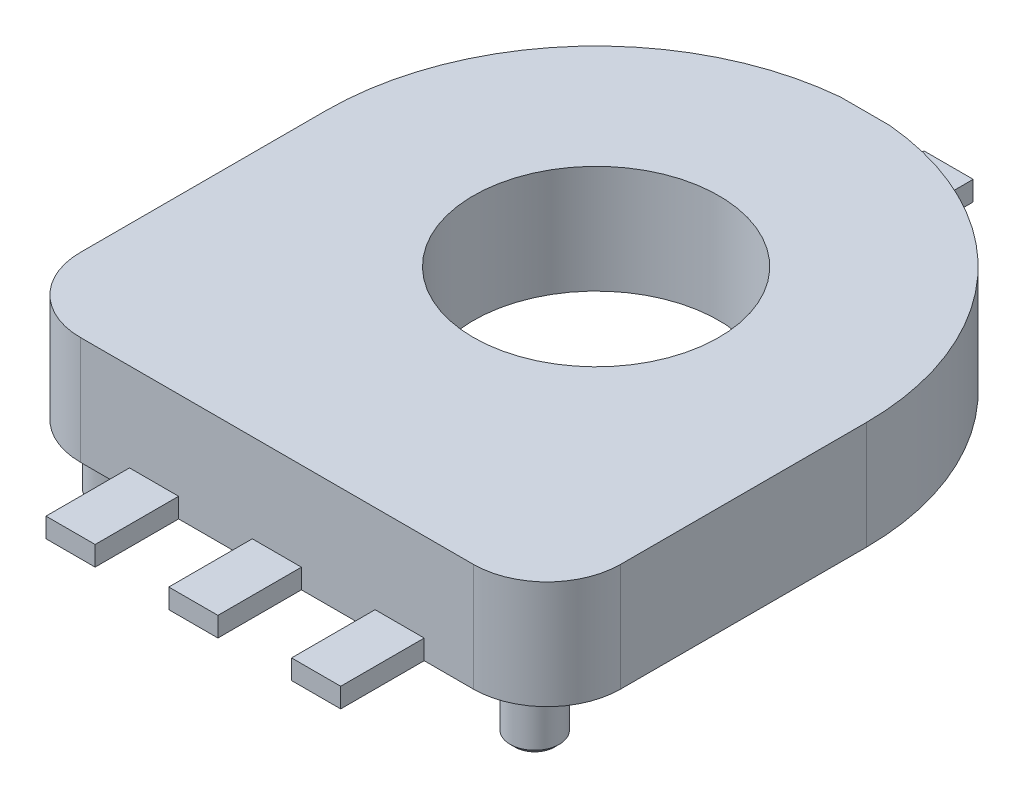
ISO-10303-21;
HEADER;
FILE_DESCRIPTION(('STEP AP214'),'2;1');
FILE_NAME('part.step','',(''),(''),'','','');
FILE_SCHEMA(('AUTOMOTIVE_DESIGN { 1 0 10303 214 1 1 1 1 }'));
ENDSEC;
DATA;
#1=APPLICATION_CONTEXT('core data for automotive mechanical design processes');
#2=APPLICATION_PROTOCOL_DEFINITION('international standard','automotive_design',2000,#1);
#3=PRODUCT_CONTEXT('',#1,'mechanical');
#4=PRODUCT('Part','Part','',(#3));
#5=PRODUCT_RELATED_PRODUCT_CATEGORY('part','',(#4));
#6=PRODUCT_DEFINITION_FORMATION('','',#4);
#7=PRODUCT_DEFINITION_CONTEXT('part definition',#1,'design');
#8=PRODUCT_DEFINITION('design','',#6,#7);
#9=PRODUCT_DEFINITION_SHAPE('','',#8);
#10=(LENGTH_UNIT() NAMED_UNIT(*) SI_UNIT(.MILLI.,.METRE.));
#11=(NAMED_UNIT(*) PLANE_ANGLE_UNIT() SI_UNIT($,.RADIAN.));
#12=(NAMED_UNIT(*) SI_UNIT($,.STERADIAN.) SOLID_ANGLE_UNIT());
#13=UNCERTAINTY_MEASURE_WITH_UNIT(LENGTH_MEASURE(1.E-05),#10,'distance_accuracy_value','');
#14=(GEOMETRIC_REPRESENTATION_CONTEXT(3) GLOBAL_UNCERTAINTY_ASSIGNED_CONTEXT((#13)) GLOBAL_UNIT_ASSIGNED_CONTEXT((#10,
#11,#12)) REPRESENTATION_CONTEXT('',''));
#15=CARTESIAN_POINT('',(0.,0.,0.));
#16=DIRECTION('',(0.,0.,1.));
#17=DIRECTION('',(1.,0.,0.));
#18=AXIS2_PLACEMENT_3D('',#15,#16,#17);
#19=CARTESIAN_POINT('',(5.,1.1,0.));
#20=DIRECTION('',(1.,0.,0.));
#21=DIRECTION('',(0.,0.,-1.));
#22=AXIS2_PLACEMENT_3D('',#19,#20,#21);
#23=PLANE('',#22);
#24=DIRECTION('',(0.,0.,1.));
#25=VECTOR('',#24,1.);
#26=CARTESIAN_POINT('',(5.,-0.7,0.));
#27=LINE('',#26,#25);
#28=CARTESIAN_POINT('',(5.,-0.7,0.));
#29=VERTEX_POINT('',#28);
#30=CARTESIAN_POINT('',(5.,-0.7,1.7));
#31=VERTEX_POINT('',#30);
#32=EDGE_CURVE('E786',#29,#31,#27,.T.);
#33=ORIENTED_EDGE('',*,*,#32,.F.);
#34=DIRECTION('',(0.,-1.,0.));
#35=VECTOR('',#34,1.);
#36=CARTESIAN_POINT('',(5.,1.1,0.));
#37=LINE('',#36,#35);
#38=CARTESIAN_POINT('',(5.,-1.1,0.));
#39=VERTEX_POINT('',#38);
#40=EDGE_CURVE('E145',#29,#39,#37,.T.);
#41=ORIENTED_EDGE('',*,*,#40,.T.);
#42=DIRECTION('',(0.,0.,1.));
#43=VECTOR('',#42,1.);
#44=CARTESIAN_POINT('',(5.,-1.1,0.));
#45=LINE('',#44,#43);
#46=CARTESIAN_POINT('',(5.,-1.1,1.7));
#47=VERTEX_POINT('',#46);
#48=EDGE_CURVE('E206',#39,#47,#45,.T.);
#49=ORIENTED_EDGE('',*,*,#48,.T.);
#50=DIRECTION('',(0.,-1.,0.));
#51=VECTOR('',#50,1.);
#52=CARTESIAN_POINT('',(5.,1.1,1.7));
#53=LINE('',#52,#51);
#54=EDGE_CURVE('E342',#31,#47,#53,.T.);
#55=ORIENTED_EDGE('',*,*,#54,.F.);
#56=EDGE_LOOP('',(#33,#41,#49,#55));
#57=FACE_BOUND('',#56,.T.);
#58=ADVANCED_FACE('F47',(#57),#23,.F.);
#59=CARTESIAN_POINT('',(0.,1.1,1.7));
#60=DIRECTION('',(0.,0.,-1.));
#61=DIRECTION('',(-1.,0.,0.));
#62=AXIS2_PLACEMENT_3D('',#59,#60,#61);
#63=PLANE('',#62);
#64=DIRECTION('',(1.,0.,0.));
#65=VECTOR('',#64,1.);
#66=CARTESIAN_POINT('',(0.,-0.7,1.7));
#67=LINE('',#66,#65);
#68=CARTESIAN_POINT('',(6.,-0.7,1.7));
#69=VERTEX_POINT('',#68);
#70=EDGE_CURVE('E832',#31,#69,#67,.T.);
#71=ORIENTED_EDGE('',*,*,#70,.F.);
#72=ORIENTED_EDGE('',*,*,#54,.T.);
#73=DIRECTION('',(1.,0.,0.));
#74=VECTOR('',#73,1.);
#75=CARTESIAN_POINT('',(0.,-1.1,1.7));
#76=LINE('',#75,#74);
#77=CARTESIAN_POINT('',(6.,-1.1,1.7));
#78=VERTEX_POINT('',#77);
#79=EDGE_CURVE('E209',#47,#78,#76,.T.);
#80=ORIENTED_EDGE('',*,*,#79,.T.);
#81=DIRECTION('',(0.,-1.,0.));
#82=VECTOR('',#81,1.);
#83=CARTESIAN_POINT('',(6.,1.1,1.7));
#84=LINE('',#83,#82);
#85=EDGE_CURVE('E339',#69,#78,#84,.T.);
#86=ORIENTED_EDGE('',*,*,#85,.F.);
#87=EDGE_LOOP('',(#71,#72,#80,#86));
#88=FACE_BOUND('',#87,.T.);
#89=ADVANCED_FACE('F373',(#88),#63,.F.);
#90=CARTESIAN_POINT('',(6.,1.1,0.));
#91=DIRECTION('',(1.,0.,0.));
#92=DIRECTION('',(0.,0.,-1.));
#93=AXIS2_PLACEMENT_3D('',#90,#91,#92);
#94=PLANE('',#93);
#95=DIRECTION('',(0.,-1.,0.));
#96=VECTOR('',#95,1.);
#97=CARTESIAN_POINT('',(6.,1.1,0.));
#98=LINE('',#97,#96);
#99=CARTESIAN_POINT('',(6.,-0.7,0.));
#100=VERTEX_POINT('',#99);
#101=CARTESIAN_POINT('',(6.,-1.1,0.));
#102=VERTEX_POINT('',#101);
#103=EDGE_CURVE('E336',#100,#102,#98,.T.);
#104=ORIENTED_EDGE('',*,*,#103,.F.);
#105=DIRECTION('',(0.,0.,-1.));
#106=VECTOR('',#105,1.);
#107=CARTESIAN_POINT('',(6.,-0.7,0.));
#108=LINE('',#107,#106);
#109=EDGE_CURVE('E835',#69,#100,#108,.T.);
#110=ORIENTED_EDGE('',*,*,#109,.F.);
#111=ORIENTED_EDGE('',*,*,#85,.T.);
#112=DIRECTION('',(0.,0.,1.));
#113=VECTOR('',#112,1.);
#114=CARTESIAN_POINT('',(6.,-1.1,0.));
#115=LINE('',#114,#113);
#116=EDGE_CURVE('E214',#102,#78,#115,.T.);
#117=ORIENTED_EDGE('',*,*,#116,.F.);
#118=EDGE_LOOP('',(#104,#110,#111,#117));
#119=FACE_BOUND('',#118,.T.);
#120=ADVANCED_FACE('F377',(#119),#94,.T.);
#121=CARTESIAN_POINT('',(7.5,1.1,0.));
#122=DIRECTION('',(1.,0.,0.));
#123=DIRECTION('',(0.,0.,-1.));
#124=AXIS2_PLACEMENT_3D('',#121,#122,#123);
#125=PLANE('',#124);
#126=DIRECTION('',(0.,0.,1.));
#127=VECTOR('',#126,1.);
#128=CARTESIAN_POINT('',(7.5,-0.7,0.));
#129=LINE('',#128,#127);
#130=CARTESIAN_POINT('',(7.5,-0.7,0.));
#131=VERTEX_POINT('',#130);
#132=CARTESIAN_POINT('',(7.5,-0.7,1.7));
#133=VERTEX_POINT('',#132);
#134=EDGE_CURVE('E830',#131,#133,#129,.T.);
#135=ORIENTED_EDGE('',*,*,#134,.F.);
#136=DIRECTION('',(0.,-1.,0.));
#137=VECTOR('',#136,1.);
#138=CARTESIAN_POINT('',(7.5,1.1,0.));
#139=LINE('',#138,#137);
#140=CARTESIAN_POINT('',(7.5,-1.1,0.));
#141=VERTEX_POINT('',#140);
#142=EDGE_CURVE('E333',#131,#141,#139,.T.);
#143=ORIENTED_EDGE('',*,*,#142,.T.);
#144=DIRECTION('',(0.,0.,1.));
#145=VECTOR('',#144,1.);
#146=CARTESIAN_POINT('',(7.5,-1.1,0.));
#147=LINE('',#146,#145);
#148=CARTESIAN_POINT('',(7.5,-1.1,1.7));
#149=VERTEX_POINT('',#148);
#150=EDGE_CURVE('E222',#141,#149,#147,.T.);
#151=ORIENTED_EDGE('',*,*,#150,.T.);
#152=DIRECTION('',(0.,-1.,0.));
#153=VECTOR('',#152,1.);
#154=CARTESIAN_POINT('',(7.5,1.1,1.7));
#155=LINE('',#154,#153);
#156=EDGE_CURVE('E330',#133,#149,#155,.T.);
#157=ORIENTED_EDGE('',*,*,#156,.F.);
#158=EDGE_LOOP('',(#135,#143,#151,#157));
#159=FACE_BOUND('',#158,.T.);
#160=ADVANCED_FACE('F388',(#159),#125,.F.);
#161=CARTESIAN_POINT('',(0.,1.1,1.7));
#162=DIRECTION('',(0.,0.,-1.));
#163=DIRECTION('',(-1.,0.,0.));
#164=AXIS2_PLACEMENT_3D('',#161,#162,#163);
#165=PLANE('',#164);
#166=DIRECTION('',(1.,0.,0.));
#167=VECTOR('',#166,1.);
#168=CARTESIAN_POINT('',(0.,-0.7,1.7));
#169=LINE('',#168,#167);
#170=CARTESIAN_POINT('',(8.5,-0.7,1.7));
#171=VERTEX_POINT('',#170);
#172=EDGE_CURVE('E827',#133,#171,#169,.T.);
#173=ORIENTED_EDGE('',*,*,#172,.F.);
#174=ORIENTED_EDGE('',*,*,#156,.T.);
#175=DIRECTION('',(1.,0.,0.));
#176=VECTOR('',#175,1.);
#177=CARTESIAN_POINT('',(0.,-1.1,1.7));
#178=LINE('',#177,#176);
#179=CARTESIAN_POINT('',(8.5,-1.1,1.7));
#180=VERTEX_POINT('',#179);
#181=EDGE_CURVE('E228',#149,#180,#178,.T.);
#182=ORIENTED_EDGE('',*,*,#181,.T.);
#183=DIRECTION('',(0.,-1.,0.));
#184=VECTOR('',#183,1.);
#185=CARTESIAN_POINT('',(8.5,1.1,1.7));
#186=LINE('',#185,#184);
#187=EDGE_CURVE('E327',#171,#180,#186,.T.);
#188=ORIENTED_EDGE('',*,*,#187,.F.);
#189=EDGE_LOOP('',(#173,#174,#182,#188));
#190=FACE_BOUND('',#189,.T.);
#191=ADVANCED_FACE('F392',(#190),#165,.F.);
#192=CARTESIAN_POINT('',(8.5,1.1,0.));
#193=DIRECTION('',(1.,0.,0.));
#194=DIRECTION('',(0.,0.,-1.));
#195=AXIS2_PLACEMENT_3D('',#192,#193,#194);
#196=PLANE('',#195);
#197=DIRECTION('',(0.,-1.,0.));
#198=VECTOR('',#197,1.);
#199=CARTESIAN_POINT('',(8.5,1.1,0.));
#200=LINE('',#199,#198);
#201=CARTESIAN_POINT('',(8.5,-0.7,0.));
#202=VERTEX_POINT('',#201);
#203=CARTESIAN_POINT('',(8.5,-1.1,0.));
#204=VERTEX_POINT('',#203);
#205=EDGE_CURVE('E324',#202,#204,#200,.T.);
#206=ORIENTED_EDGE('',*,*,#205,.F.);
#207=DIRECTION('',(0.,0.,-1.));
#208=VECTOR('',#207,1.);
#209=CARTESIAN_POINT('',(8.5,-0.7,0.));
#210=LINE('',#209,#208);
#211=EDGE_CURVE('E210',#171,#202,#210,.T.);
#212=ORIENTED_EDGE('',*,*,#211,.F.);
#213=ORIENTED_EDGE('',*,*,#187,.T.);
#214=DIRECTION('',(0.,0.,1.));
#215=VECTOR('',#214,1.);
#216=CARTESIAN_POINT('',(8.5,-1.1,0.));
#217=LINE('',#216,#215);
#218=EDGE_CURVE('E232',#204,#180,#217,.T.);
#219=ORIENTED_EDGE('',*,*,#218,.F.);
#220=EDGE_LOOP('',(#206,#212,#213,#219));
#221=FACE_BOUND('',#220,.T.);
#222=ADVANCED_FACE('F396',(#221),#196,.T.);
#223=CARTESIAN_POINT('',(6.00000000000001,1.1,0.));
#224=DIRECTION('',(1.,0.,0.));
#225=DIRECTION('',(0.,0.,-1.));
#226=AXIS2_PLACEMENT_3D('',#223,#224,#225);
#227=PLANE('',#226);
#228=DIRECTION('',(0.,-1.,0.));
#229=VECTOR('',#228,1.);
#230=CARTESIAN_POINT('',(6.,1.1,-13.6772255750517));
#231=LINE('',#230,#229);
#232=CARTESIAN_POINT('',(6.,-0.7,-13.6772255750517));
#233=VERTEX_POINT('',#232);
#234=CARTESIAN_POINT('',(6.,-1.1,-13.6772255750517));
#235=VERTEX_POINT('',#234);
#236=EDGE_CURVE('E307',#233,#235,#231,.T.);
#237=ORIENTED_EDGE('',*,*,#236,.F.);
#238=DIRECTION('',(0.,0.,-1.));
#239=VECTOR('',#238,1.);
#240=CARTESIAN_POINT('',(6.00000000000001,-0.7,0.));
#241=LINE('',#240,#239);
#242=CARTESIAN_POINT('',(6.,-0.7,-11.9772255750517));
#243=VERTEX_POINT('',#242);
#244=EDGE_CURVE('E765',#243,#233,#241,.T.);
#245=ORIENTED_EDGE('',*,*,#244,.F.);
#246=DIRECTION('',(0.,-1.,0.));
#247=VECTOR('',#246,1.);
#248=CARTESIAN_POINT('',(6.,1.1,-11.9772255750517));
#249=LINE('',#248,#247);
#250=CARTESIAN_POINT('',(6.,-1.1,-11.9772255750517));
#251=VERTEX_POINT('',#250);
#252=EDGE_CURVE('E310',#243,#251,#249,.T.);
#253=ORIENTED_EDGE('',*,*,#252,.T.);
#254=DIRECTION('',(0.,0.,1.));
#255=VECTOR('',#254,1.);
#256=CARTESIAN_POINT('',(6.00000000000001,-1.1,0.));
#257=LINE('',#256,#255);
#258=EDGE_CURVE('E248',#235,#251,#257,.T.);
#259=ORIENTED_EDGE('',*,*,#258,.F.);
#260=EDGE_LOOP('',(#237,#245,#253,#259));
#261=FACE_BOUND('',#260,.T.);
#262=ADVANCED_FACE('F400',(#261),#227,.T.);
#263=CARTESIAN_POINT('',(0.,1.1,-13.6772255750517));
#264=DIRECTION('',(0.,0.,1.));
#265=DIRECTION('',(1.,0.,0.));
#266=AXIS2_PLACEMENT_3D('',#263,#264,#265);
#267=PLANE('',#266);
#268=DIRECTION('',(-1.,0.,0.));
#269=VECTOR('',#268,1.);
#270=CARTESIAN_POINT('',(0.,-0.7,-13.6772255750517));
#271=LINE('',#270,#269);
#272=CARTESIAN_POINT('',(5.,-0.7,-13.6772255750517));
#273=VERTEX_POINT('',#272);
#274=EDGE_CURVE('E796',#233,#273,#271,.T.);
#275=ORIENTED_EDGE('',*,*,#274,.F.);
#276=ORIENTED_EDGE('',*,*,#236,.T.);
#277=DIRECTION('',(-1.,0.,0.));
#278=VECTOR('',#277,1.);
#279=CARTESIAN_POINT('',(0.,-1.1,-13.6772255750517));
#280=LINE('',#279,#278);
#281=CARTESIAN_POINT('',(5.,-1.1,-13.6772255750517));
#282=VERTEX_POINT('',#281);
#283=EDGE_CURVE('E252',#235,#282,#280,.T.);
#284=ORIENTED_EDGE('',*,*,#283,.T.);
#285=DIRECTION('',(0.,-1.,0.));
#286=VECTOR('',#285,1.);
#287=CARTESIAN_POINT('',(5.,1.1,-13.6772255750517));
#288=LINE('',#287,#286);
#289=EDGE_CURVE('E304',#273,#282,#288,.T.);
#290=ORIENTED_EDGE('',*,*,#289,.F.);
#291=EDGE_LOOP('',(#275,#276,#284,#290));
#292=FACE_BOUND('',#291,.T.);
#293=ADVANCED_FACE('F413',(#292),#267,.F.);
#294=CARTESIAN_POINT('',(5.,1.1,0.));
#295=DIRECTION('',(1.,0.,0.));
#296=DIRECTION('',(0.,0.,-1.));
#297=AXIS2_PLACEMENT_3D('',#294,#295,#296);
#298=PLANE('',#297);
#299=DIRECTION('',(0.,0.,1.));
#300=VECTOR('',#299,1.);
#301=CARTESIAN_POINT('',(5.,-0.7,0.));
#302=LINE('',#301,#300);
#303=CARTESIAN_POINT('',(5.,-0.7,-11.9772255750517));
#304=VERTEX_POINT('',#303);
#305=EDGE_CURVE('E800',#273,#304,#302,.T.);
#306=ORIENTED_EDGE('',*,*,#305,.F.);
#307=ORIENTED_EDGE('',*,*,#289,.T.);
#308=DIRECTION('',(0.,0.,1.));
#309=VECTOR('',#308,1.);
#310=CARTESIAN_POINT('',(5.,-1.1,0.));
#311=LINE('',#310,#309);
#312=CARTESIAN_POINT('',(5.,-1.1,-11.9772255750517));
#313=VERTEX_POINT('',#312);
#314=EDGE_CURVE('E256',#282,#313,#311,.T.);
#315=ORIENTED_EDGE('',*,*,#314,.T.);
#316=DIRECTION('',(0.,-1.,0.));
#317=VECTOR('',#316,1.);
#318=CARTESIAN_POINT('',(5.,1.1,-11.9772255750517));
#319=LINE('',#318,#317);
#320=EDGE_CURVE('E178',#304,#313,#319,.T.);
#321=ORIENTED_EDGE('',*,*,#320,.F.);
#322=EDGE_LOOP('',(#306,#307,#315,#321));
#323=FACE_BOUND('',#322,.T.);
#324=ADVANCED_FACE('F417',(#323),#298,.F.);
#325=CARTESIAN_POINT('',(2.5,1.1,0.));
#326=DIRECTION('',(1.,0.,0.));
#327=DIRECTION('',(0.,0.,-1.));
#328=AXIS2_PLACEMENT_3D('',#325,#326,#327);
#329=PLANE('',#328);
#330=DIRECTION('',(0.,0.,1.));
#331=VECTOR('',#330,1.);
#332=CARTESIAN_POINT('',(2.5,-0.7,0.));
#333=LINE('',#332,#331);
#334=CARTESIAN_POINT('',(2.5,-0.7,0.));
#335=VERTEX_POINT('',#334);
#336=CARTESIAN_POINT('',(2.5,-0.7,1.7));
#337=VERTEX_POINT('',#336);
#338=EDGE_CURVE('E771',#335,#337,#333,.T.);
#339=ORIENTED_EDGE('',*,*,#338,.F.);
#340=DIRECTION('',(0.,-1.,0.));
#341=VECTOR('',#340,1.);
#342=CARTESIAN_POINT('',(2.5,1.1,0.));
#343=LINE('',#342,#341);
#344=CARTESIAN_POINT('',(2.5,-1.1,0.));
#345=VERTEX_POINT('',#344);
#346=EDGE_CURVE('E294',#335,#345,#343,.T.);
#347=ORIENTED_EDGE('',*,*,#346,.T.);
#348=DIRECTION('',(0.,0.,1.));
#349=VECTOR('',#348,1.);
#350=CARTESIAN_POINT('',(2.5,-1.1,0.));
#351=LINE('',#350,#349);
#352=CARTESIAN_POINT('',(2.5,-1.1,1.7));
#353=VERTEX_POINT('',#352);
#354=EDGE_CURVE('E268',#345,#353,#351,.T.);
#355=ORIENTED_EDGE('',*,*,#354,.T.);
#356=DIRECTION('',(0.,-1.,0.));
#357=VECTOR('',#356,1.);
#358=CARTESIAN_POINT('',(2.5,1.1,1.7));
#359=LINE('',#358,#357);
#360=EDGE_CURVE('E291',#337,#353,#359,.T.);
#361=ORIENTED_EDGE('',*,*,#360,.F.);
#362=EDGE_LOOP('',(#339,#347,#355,#361));
#363=FACE_BOUND('',#362,.T.);
#364=ADVANCED_FACE('F421',(#363),#329,.F.);
#365=CARTESIAN_POINT('',(0.,1.1,1.7));
#366=DIRECTION('',(0.,0.,-1.));
#367=DIRECTION('',(-1.,0.,0.));
#368=AXIS2_PLACEMENT_3D('',#365,#366,#367);
#369=PLANE('',#368);
#370=DIRECTION('',(1.,0.,0.));
#371=VECTOR('',#370,1.);
#372=CARTESIAN_POINT('',(0.,-0.7,1.7));
#373=LINE('',#372,#371);
#374=CARTESIAN_POINT('',(3.5,-0.7,1.7));
#375=VERTEX_POINT('',#374);
#376=EDGE_CURVE('E768',#337,#375,#373,.T.);
#377=ORIENTED_EDGE('',*,*,#376,.F.);
#378=ORIENTED_EDGE('',*,*,#360,.T.);
#379=DIRECTION('',(1.,0.,0.));
#380=VECTOR('',#379,1.);
#381=CARTESIAN_POINT('',(0.,-1.1,1.7));
#382=LINE('',#381,#380);
#383=CARTESIAN_POINT('',(3.5,-1.1,1.7));
#384=VERTEX_POINT('',#383);
#385=EDGE_CURVE('E272',#353,#384,#382,.T.);
#386=ORIENTED_EDGE('',*,*,#385,.T.);
#387=DIRECTION('',(0.,-1.,0.));
#388=VECTOR('',#387,1.);
#389=CARTESIAN_POINT('',(3.5,1.1,1.7));
#390=LINE('',#389,#388);
#391=EDGE_CURVE('E288',#375,#384,#390,.T.);
#392=ORIENTED_EDGE('',*,*,#391,.F.);
#393=EDGE_LOOP('',(#377,#378,#386,#392));
#394=FACE_BOUND('',#393,.T.);
#395=ADVANCED_FACE('F434',(#394),#369,.F.);
#396=CARTESIAN_POINT('',(3.5,1.1,0.));
#397=DIRECTION('',(1.,0.,0.));
#398=DIRECTION('',(0.,0.,-1.));
#399=AXIS2_PLACEMENT_3D('',#396,#397,#398);
#400=PLANE('',#399);
#401=DIRECTION('',(0.,-1.,0.));
#402=VECTOR('',#401,1.);
#403=CARTESIAN_POINT('',(3.5,1.1,0.));
#404=LINE('',#403,#402);
#405=CARTESIAN_POINT('',(3.5,-0.7,0.));
#406=VERTEX_POINT('',#405);
#407=CARTESIAN_POINT('',(3.5,-1.1,0.));
#408=VERTEX_POINT('',#407);
#409=EDGE_CURVE('E137',#406,#408,#404,.T.);
#410=ORIENTED_EDGE('',*,*,#409,.F.);
#411=DIRECTION('',(0.,0.,-1.));
#412=VECTOR('',#411,1.);
#413=CARTESIAN_POINT('',(3.5,-0.7,0.));
#414=LINE('',#413,#412);
#415=EDGE_CURVE('E770',#375,#406,#414,.T.);
#416=ORIENTED_EDGE('',*,*,#415,.F.);
#417=ORIENTED_EDGE('',*,*,#391,.T.);
#418=DIRECTION('',(0.,0.,1.));
#419=VECTOR('',#418,1.);
#420=CARTESIAN_POINT('',(3.5,-1.1,0.));
#421=LINE('',#420,#419);
#422=EDGE_CURVE('E276',#408,#384,#421,.T.);
#423=ORIENTED_EDGE('',*,*,#422,.F.);
#424=EDGE_LOOP('',(#410,#416,#417,#423));
#425=FACE_BOUND('',#424,.T.);
#426=ADVANCED_FACE('F438',(#425),#400,.T.);
#427=CARTESIAN_POINT('',(0.,1.1,0.));
#428=DIRECTION('',(0.,1.,0.));
#429=DIRECTION('',(0.,0.,1.));
#430=AXIS2_PLACEMENT_3D('',#427,#428,#429);
#431=PLANE('',#430);
#432=CARTESIAN_POINT('',(5.5,1.1,-6.5));
#433=DIRECTION('',(0.,1.,0.));
#434=DIRECTION('',(0.,0.,1.));
#435=AXIS2_PLACEMENT_3D('',#432,#433,#434);
#436=CIRCLE('',#435,2.5);
#437=CARTESIAN_POINT('',(5.5,1.1,-4.));
#438=VERTEX_POINT('',#437);
#439=EDGE_CURVE('E199',#438,#438,#436,.T.);
#440=ORIENTED_EDGE('',*,*,#439,.F.);
#441=EDGE_LOOP('',(#440));
#442=FACE_BOUND('',#441,.T.);
#443=DIRECTION('',(-1.,0.,0.));
#444=VECTOR('',#443,1.);
#445=CARTESIAN_POINT('',(0.,1.1,0.));
#446=LINE('',#445,#444);
#447=CARTESIAN_POINT('',(9.49999999999999,1.1,0.));
#448=VERTEX_POINT('',#447);
#449=CARTESIAN_POINT('',(1.50000000000001,1.1,0.));
#450=VERTEX_POINT('',#449);
#451=EDGE_CURVE('E66',#448,#450,#446,.T.);
#452=ORIENTED_EDGE('',*,*,#451,.F.);
#453=CARTESIAN_POINT('',(9.5,1.1,-1.5));
#454=DIRECTION('',(0.,1.,0.));
#455=DIRECTION('',(0.,0.,1.));
#456=AXIS2_PLACEMENT_3D('',#453,#454,#455);
#457=CIRCLE('',#456,1.5);
#458=CARTESIAN_POINT('',(11.,1.1,-1.50000000000001));
#459=VERTEX_POINT('',#458);
#460=EDGE_CURVE('E809',#459,#448,#457,.F.);
#461=ORIENTED_EDGE('',*,*,#460,.F.);
#462=DIRECTION('',(0.,0.,1.));
#463=VECTOR('',#462,1.);
#464=CARTESIAN_POINT('',(11.,1.1,0.));
#465=LINE('',#464,#463);
#466=CARTESIAN_POINT('',(11.,1.1,-6.5));
#467=VERTEX_POINT('',#466);
#468=EDGE_CURVE('E777',#467,#459,#465,.T.);
#469=ORIENTED_EDGE('',*,*,#468,.F.);
#470=CARTESIAN_POINT('',(5.5,1.1,-6.5));
#471=DIRECTION('',(0.,1.,0.));
#472=DIRECTION('',(0.,0.,1.));
#473=AXIS2_PLACEMENT_3D('',#470,#471,#472);
#474=CIRCLE('',#473,5.5);
#475=CARTESIAN_POINT('',(6.,1.1,-11.9772255750517));
#476=VERTEX_POINT('',#475);
#477=EDGE_CURVE('E189',#476,#467,#474,.F.);
#478=ORIENTED_EDGE('',*,*,#477,.F.);
#479=DIRECTION('',(1.,0.,0.));
#480=VECTOR('',#479,1.);
#481=CARTESIAN_POINT('',(0.,1.1,-11.9772255750517));
#482=LINE('',#481,#480);
#483=CARTESIAN_POINT('',(5.,1.1,-11.9772255750517));
#484=VERTEX_POINT('',#483);
#485=EDGE_CURVE('E187',#484,#476,#482,.T.);
#486=ORIENTED_EDGE('',*,*,#485,.F.);
#487=CARTESIAN_POINT('',(0.,1.1,-6.5));
#488=VERTEX_POINT('',#487);
#489=EDGE_CURVE('E170',#488,#484,#474,.F.);
#490=ORIENTED_EDGE('',*,*,#489,.F.);
#491=DIRECTION('',(0.,0.,-1.));
#492=VECTOR('',#491,1.);
#493=CARTESIAN_POINT('',(0.,1.1,0.));
#494=LINE('',#493,#492);
#495=CARTESIAN_POINT('',(0.,1.1,-1.50000000000001));
#496=VERTEX_POINT('',#495);
#497=EDGE_CURVE('E184',#496,#488,#494,.T.);
#498=ORIENTED_EDGE('',*,*,#497,.F.);
#499=CARTESIAN_POINT('',(1.5,1.1,-1.5));
#500=DIRECTION('',(0.,1.,0.));
#501=DIRECTION('',(0.,0.,1.));
#502=AXIS2_PLACEMENT_3D('',#499,#500,#501);
#503=CIRCLE('',#502,1.5);
#504=EDGE_CURVE('E194',#496,#450,#503,.T.);
#505=ORIENTED_EDGE('',*,*,#504,.T.);
#506=EDGE_LOOP('',(#452,#461,#469,#478,#486,#490,#498,#505));
#507=FACE_BOUND('',#506,.T.);
#508=ADVANCED_FACE('F183',(#442,#507),#431,.T.);
#509=CARTESIAN_POINT('',(9.5,1.1,-1.5));
#510=DIRECTION('',(0.,-1.,0.));
#511=DIRECTION('',(0.,0.,-1.));
#512=AXIS2_PLACEMENT_3D('',#509,#510,#511);
#513=CYLINDRICAL_SURFACE('',#512,1.5);
#514=CARTESIAN_POINT('',(9.5,-1.1,-1.5));
#515=DIRECTION('',(0.,1.,0.));
#516=DIRECTION('',(0.,0.,1.));
#517=AXIS2_PLACEMENT_3D('',#514,#515,#516);
#518=CIRCLE('',#517,1.5);
#519=CARTESIAN_POINT('',(11.,-1.1,-1.50000000000001));
#520=VERTEX_POINT('',#519);
#521=CARTESIAN_POINT('',(9.49999999999999,-1.1,0.));
#522=VERTEX_POINT('',#521);
#523=EDGE_CURVE('E236',#520,#522,#518,.F.);
#524=ORIENTED_EDGE('',*,*,#523,.F.);
#525=DIRECTION('',(0.,-1.,0.));
#526=VECTOR('',#525,1.);
#527=CARTESIAN_POINT('',(11.,1.1,-1.50000000000001));
#528=LINE('',#527,#526);
#529=EDGE_CURVE('E318',#459,#520,#528,.T.);
#530=ORIENTED_EDGE('',*,*,#529,.F.);
#531=ORIENTED_EDGE('',*,*,#460,.T.);
#532=DIRECTION('',(0.,-1.,0.));
#533=VECTOR('',#532,1.);
#534=CARTESIAN_POINT('',(9.49999999999999,1.1,0.));
#535=LINE('',#534,#533);
#536=EDGE_CURVE('E321',#448,#522,#535,.T.);
#537=ORIENTED_EDGE('',*,*,#536,.T.);
#538=EDGE_LOOP('',(#524,#530,#531,#537));
#539=FACE_BOUND('',#538,.T.);
#540=ADVANCED_FACE('F402',(#539),#513,.T.);
#541=CARTESIAN_POINT('',(11.,1.1,0.));
#542=DIRECTION('',(1.,0.,0.));
#543=DIRECTION('',(0.,0.,-1.));
#544=AXIS2_PLACEMENT_3D('',#541,#542,#543);
#545=PLANE('',#544);
#546=DIRECTION('',(0.,0.,1.));
#547=VECTOR('',#546,1.);
#548=CARTESIAN_POINT('',(11.,-1.1,0.));
#549=LINE('',#548,#547);
#550=CARTESIAN_POINT('',(11.,-1.1,-6.5));
#551=VERTEX_POINT('',#550);
#552=EDGE_CURVE('E240',#551,#520,#549,.T.);
#553=ORIENTED_EDGE('',*,*,#552,.F.);
#554=DIRECTION('',(0.,-1.,0.));
#555=VECTOR('',#554,1.);
#556=CARTESIAN_POINT('',(11.,1.1,-6.5));
#557=LINE('',#556,#555);
#558=EDGE_CURVE('E315',#467,#551,#557,.T.);
#559=ORIENTED_EDGE('',*,*,#558,.F.);
#560=ORIENTED_EDGE('',*,*,#468,.T.);
#561=ORIENTED_EDGE('',*,*,#529,.T.);
#562=EDGE_LOOP('',(#553,#559,#560,#561));
#563=FACE_BOUND('',#562,.T.);
#564=ADVANCED_FACE('F405',(#563),#545,.T.);
#565=CARTESIAN_POINT('',(5.5,1.1,-6.5));
#566=DIRECTION('',(0.,-1.,0.));
#567=DIRECTION('',(0.,0.,-1.));
#568=AXIS2_PLACEMENT_3D('',#565,#566,#567);
#569=CYLINDRICAL_SURFACE('',#568,5.5);
#570=CARTESIAN_POINT('',(5.5,-1.1,-6.5));
#571=DIRECTION('',(0.,1.,0.));
#572=DIRECTION('',(0.,0.,1.));
#573=AXIS2_PLACEMENT_3D('',#570,#571,#572);
#574=CIRCLE('',#573,5.5);
#575=EDGE_CURVE('E244',#251,#551,#574,.F.);
#576=ORIENTED_EDGE('',*,*,#575,.F.);
#577=ORIENTED_EDGE('',*,*,#252,.F.);
#578=EDGE_CURVE('E311',#476,#243,#249,.T.);
#579=ORIENTED_EDGE('',*,*,#578,.F.);
#580=ORIENTED_EDGE('',*,*,#477,.T.);
#581=ORIENTED_EDGE('',*,*,#558,.T.);
#582=EDGE_LOOP('',(#576,#577,#579,#580,#581));
#583=FACE_BOUND('',#582,.T.);
#584=ADVANCED_FACE('F409',(#583),#569,.T.);
#585=CARTESIAN_POINT('',(0.,-1.1,-6.5));
#586=VERTEX_POINT('',#585);
#587=EDGE_CURVE('E172',#586,#313,#574,.F.);
#588=ORIENTED_EDGE('',*,*,#587,.F.);
#589=DIRECTION('',(0.,-1.,0.));
#590=VECTOR('',#589,1.);
#591=CARTESIAN_POINT('',(0.,1.1,-6.5));
#592=LINE('',#591,#590);
#593=EDGE_CURVE('E166',#488,#586,#592,.T.);
#594=ORIENTED_EDGE('',*,*,#593,.F.);
#595=ORIENTED_EDGE('',*,*,#489,.T.);
#596=EDGE_CURVE('E301',#484,#304,#319,.T.);
#597=ORIENTED_EDGE('',*,*,#596,.T.);
#598=ORIENTED_EDGE('',*,*,#320,.T.);
#599=EDGE_LOOP('',(#588,#594,#595,#597,#598));
#600=FACE_BOUND('',#599,.T.);
#601=ADVANCED_FACE('F168',(#600),#569,.T.);
#602=CARTESIAN_POINT('',(0.,1.1,0.));
#603=DIRECTION('',(-1.,0.,0.));
#604=DIRECTION('',(0.,0.,1.));
#605=AXIS2_PLACEMENT_3D('',#602,#603,#604);
#606=PLANE('',#605);
#607=DIRECTION('',(0.,0.,-1.));
#608=VECTOR('',#607,1.);
#609=CARTESIAN_POINT('',(0.,-1.1,0.));
#610=LINE('',#609,#608);
#611=CARTESIAN_POINT('',(0.,-1.1,-1.50000000000001));
#612=VERTEX_POINT('',#611);
#613=EDGE_CURVE('E260',#612,#586,#610,.T.);
#614=ORIENTED_EDGE('',*,*,#613,.F.);
#615=DIRECTION('',(0.,-1.,0.));
#616=VECTOR('',#615,1.);
#617=CARTESIAN_POINT('',(0.,1.1,-1.50000000000001));
#618=LINE('',#617,#616);
#619=EDGE_CURVE('E179',#496,#612,#618,.T.);
#620=ORIENTED_EDGE('',*,*,#619,.F.);
#621=ORIENTED_EDGE('',*,*,#497,.T.);
#622=ORIENTED_EDGE('',*,*,#593,.T.);
#623=EDGE_LOOP('',(#614,#620,#621,#622));
#624=FACE_BOUND('',#623,.T.);
#625=ADVANCED_FACE('F191',(#624),#606,.T.);
#626=CARTESIAN_POINT('',(1.5,1.1,-1.5));
#627=DIRECTION('',(0.,-1.,0.));
#628=DIRECTION('',(0.,0.,-1.));
#629=AXIS2_PLACEMENT_3D('',#626,#627,#628);
#630=CYLINDRICAL_SURFACE('',#629,1.5);
#631=CARTESIAN_POINT('',(1.5,-1.1,-1.5));
#632=DIRECTION('',(0.,1.,0.));
#633=DIRECTION('',(0.,0.,1.));
#634=AXIS2_PLACEMENT_3D('',#631,#632,#633);
#635=CIRCLE('',#634,1.5);
#636=CARTESIAN_POINT('',(1.50000000000001,-1.1,0.));
#637=VERTEX_POINT('',#636);
#638=EDGE_CURVE('E263',#612,#637,#635,.T.);
#639=ORIENTED_EDGE('',*,*,#638,.T.);
#640=DIRECTION('',(0.,-1.,0.));
#641=VECTOR('',#640,1.);
#642=CARTESIAN_POINT('',(1.50000000000001,1.1,0.));
#643=LINE('',#642,#641);
#644=EDGE_CURVE('E296',#450,#637,#643,.T.);
#645=ORIENTED_EDGE('',*,*,#644,.F.);
#646=ORIENTED_EDGE('',*,*,#504,.F.);
#647=ORIENTED_EDGE('',*,*,#619,.T.);
#648=EDGE_LOOP('',(#639,#645,#646,#647));
#649=FACE_BOUND('',#648,.T.);
#650=ADVANCED_FACE('F427',(#649),#630,.T.);
#651=CARTESIAN_POINT('',(0.,1.1,0.));
#652=DIRECTION('',(0.,0.,1.));
#653=DIRECTION('',(1.,0.,0.));
#654=AXIS2_PLACEMENT_3D('',#651,#652,#653);
#655=PLANE('',#654);
#656=DIRECTION('',(-1.,0.,0.));
#657=VECTOR('',#656,1.);
#658=CARTESIAN_POINT('',(0.,-1.1,0.));
#659=LINE('',#658,#657);
#660=EDGE_CURVE('E223',#39,#408,#659,.T.);
#661=ORIENTED_EDGE('',*,*,#660,.F.);
#662=ORIENTED_EDGE('',*,*,#40,.F.);
#663=DIRECTION('',(1.,0.,0.));
#664=VECTOR('',#663,1.);
#665=CARTESIAN_POINT('',(0.,-0.7,0.));
#666=LINE('',#665,#664);
#667=EDGE_CURVE('E779',#29,#100,#666,.T.);
#668=ORIENTED_EDGE('',*,*,#667,.T.);
#669=ORIENTED_EDGE('',*,*,#103,.T.);
#670=EDGE_CURVE('E218',#141,#102,#659,.T.);
#671=ORIENTED_EDGE('',*,*,#670,.F.);
#672=ORIENTED_EDGE('',*,*,#142,.F.);
#673=DIRECTION('',(1.,0.,0.));
#674=VECTOR('',#673,1.);
#675=CARTESIAN_POINT('',(0.,-0.7,0.));
#676=LINE('',#675,#674);
#677=EDGE_CURVE('E859',#131,#202,#676,.T.);
#678=ORIENTED_EDGE('',*,*,#677,.T.);
#679=ORIENTED_EDGE('',*,*,#205,.T.);
#680=EDGE_CURVE('E224',#522,#204,#659,.T.);
#681=ORIENTED_EDGE('',*,*,#680,.F.);
#682=ORIENTED_EDGE('',*,*,#536,.F.);
#683=ORIENTED_EDGE('',*,*,#451,.T.);
#684=ORIENTED_EDGE('',*,*,#644,.T.);
#685=EDGE_CURVE('E267',#345,#637,#659,.T.);
#686=ORIENTED_EDGE('',*,*,#685,.F.);
#687=ORIENTED_EDGE('',*,*,#346,.F.);
#688=DIRECTION('',(1.,0.,0.));
#689=VECTOR('',#688,1.);
#690=CARTESIAN_POINT('',(0.,-0.7,0.));
#691=LINE('',#690,#689);
#692=EDGE_CURVE('E804',#335,#406,#691,.T.);
#693=ORIENTED_EDGE('',*,*,#692,.T.);
#694=ORIENTED_EDGE('',*,*,#409,.T.);
#695=EDGE_LOOP('',(#661,#662,#668,#669,#671,#672,#678,#679,#681,#682,#683,#684,#686,#687,#693,#694));
#696=FACE_BOUND('',#695,.T.);
#697=ADVANCED_FACE('F430',(#696),#655,.T.);
#698=CARTESIAN_POINT('',(5.5,1.1,-6.5));
#699=DIRECTION('',(0.,-1.,0.));
#700=DIRECTION('',(0.,0.,-1.));
#701=AXIS2_PLACEMENT_3D('',#698,#699,#700);
#702=CYLINDRICAL_SURFACE('',#701,2.5);
#703=ORIENTED_EDGE('',*,*,#439,.T.);
#704=EDGE_LOOP('',(#703));
#705=FACE_BOUND('',#704,.T.);
#706=CARTESIAN_POINT('',(5.5,-1.1,-6.5));
#707=DIRECTION('',(0.,1.,0.));
#708=DIRECTION('',(0.,0.,1.));
#709=AXIS2_PLACEMENT_3D('',#706,#707,#708);
#710=CIRCLE('',#709,2.5);
#711=CARTESIAN_POINT('',(5.5,-1.1,-4.));
#712=VERTEX_POINT('',#711);
#713=EDGE_CURVE('E280',#712,#712,#710,.T.);
#714=ORIENTED_EDGE('',*,*,#713,.F.);
#715=EDGE_LOOP('',(#714));
#716=FACE_BOUND('',#715,.T.);
#717=ADVANCED_FACE('F445',(#705,#716),#702,.F.);
#718=CARTESIAN_POINT('',(0.,-1.1,0.));
#719=DIRECTION('',(0.,1.,0.));
#720=DIRECTION('',(0.,0.,1.));
#721=AXIS2_PLACEMENT_3D('',#718,#719,#720);
#722=PLANE('',#721);
#723=CARTESIAN_POINT('',(9.75,-1.1,-1.));
#724=DIRECTION('',(0.,1.,0.));
#725=DIRECTION('',(0.,0.,1.));
#726=AXIS2_PLACEMENT_3D('',#723,#724,#725);
#727=CIRCLE('',#726,0.500000000000001);
#728=CARTESIAN_POINT('',(9.75,-1.1,-0.5));
#729=VERTEX_POINT('',#728);
#730=EDGE_CURVE('E349',#729,#729,#727,.F.);
#731=ORIENTED_EDGE('',*,*,#730,.F.);
#732=EDGE_LOOP('',(#731));
#733=FACE_BOUND('',#732,.T.);
#734=CARTESIAN_POINT('',(1.25,-1.1,-1.));
#735=DIRECTION('',(0.,1.,0.));
#736=DIRECTION('',(0.,0.,1.));
#737=AXIS2_PLACEMENT_3D('',#734,#735,#736);
#738=CIRCLE('',#737,0.5);
#739=CARTESIAN_POINT('',(1.25,-1.1,-0.500000000000001));
#740=VERTEX_POINT('',#739);
#741=EDGE_CURVE('E345',#740,#740,#738,.F.);
#742=ORIENTED_EDGE('',*,*,#741,.F.);
#743=EDGE_LOOP('',(#742));
#744=FACE_BOUND('',#743,.T.);
#745=ORIENTED_EDGE('',*,*,#48,.F.);
#746=ORIENTED_EDGE('',*,*,#660,.T.);
#747=ORIENTED_EDGE('',*,*,#422,.T.);
#748=ORIENTED_EDGE('',*,*,#385,.F.);
#749=ORIENTED_EDGE('',*,*,#354,.F.);
#750=ORIENTED_EDGE('',*,*,#685,.T.);
#751=ORIENTED_EDGE('',*,*,#638,.F.);
#752=ORIENTED_EDGE('',*,*,#613,.T.);
#753=ORIENTED_EDGE('',*,*,#587,.T.);
#754=ORIENTED_EDGE('',*,*,#314,.F.);
#755=ORIENTED_EDGE('',*,*,#283,.F.);
#756=ORIENTED_EDGE('',*,*,#258,.T.);
#757=ORIENTED_EDGE('',*,*,#575,.T.);
#758=ORIENTED_EDGE('',*,*,#552,.T.);
#759=ORIENTED_EDGE('',*,*,#523,.T.);
#760=ORIENTED_EDGE('',*,*,#680,.T.);
#761=ORIENTED_EDGE('',*,*,#218,.T.);
#762=ORIENTED_EDGE('',*,*,#181,.F.);
#763=ORIENTED_EDGE('',*,*,#150,.F.);
#764=ORIENTED_EDGE('',*,*,#670,.T.);
#765=ORIENTED_EDGE('',*,*,#116,.T.);
#766=ORIENTED_EDGE('',*,*,#79,.F.);
#767=EDGE_LOOP('',(#745,#746,#747,#748,#749,#750,#751,#752,#753,#754,#755,#756,#757,#758,#759,
#760,#761,#762,#763,#764,#765,#766));
#768=FACE_BOUND('',#767,.T.);
#769=ORIENTED_EDGE('',*,*,#713,.T.);
#770=EDGE_LOOP('',(#769));
#771=FACE_BOUND('',#770,.T.);
#772=ADVANCED_FACE('F448',(#733,#744,#768,#771),#722,.F.);
#773=CARTESIAN_POINT('',(0.,-0.7,-11.9772255750517));
#774=DIRECTION('',(0.,0.,1.));
#775=DIRECTION('',(1.,0.,0.));
#776=AXIS2_PLACEMENT_3D('',#773,#774,#775);
#777=PLANE('',#776);
#778=ORIENTED_EDGE('',*,*,#485,.T.);
#779=ORIENTED_EDGE('',*,*,#578,.T.);
#780=DIRECTION('',(1.,0.,0.));
#781=VECTOR('',#780,1.);
#782=CARTESIAN_POINT('',(0.,-0.7,-11.9772255750517));
#783=LINE('',#782,#781);
#784=EDGE_CURVE('E790',#304,#243,#783,.T.);
#785=ORIENTED_EDGE('',*,*,#784,.F.);
#786=ORIENTED_EDGE('',*,*,#596,.F.);
#787=EDGE_LOOP('',(#778,#779,#785,#786));
#788=FACE_BOUND('',#787,.T.);
#789=ADVANCED_FACE('F452',(#788),#777,.F.);
#790=CARTESIAN_POINT('',(0.,-0.7,0.));
#791=DIRECTION('',(0.,1.,0.));
#792=DIRECTION('',(0.,0.,1.));
#793=AXIS2_PLACEMENT_3D('',#790,#791,#792);
#794=PLANE('',#793);
#795=ORIENTED_EDGE('',*,*,#784,.T.);
#796=ORIENTED_EDGE('',*,*,#244,.T.);
#797=ORIENTED_EDGE('',*,*,#274,.T.);
#798=ORIENTED_EDGE('',*,*,#305,.T.);
#799=EDGE_LOOP('',(#795,#796,#797,#798));
#800=FACE_BOUND('',#799,.T.);
#801=ADVANCED_FACE('F459',(#800),#794,.T.);
#802=CARTESIAN_POINT('',(0.,-0.7,0.));
#803=DIRECTION('',(0.,1.,0.));
#804=DIRECTION('',(0.,0.,1.));
#805=AXIS2_PLACEMENT_3D('',#802,#803,#804);
#806=PLANE('',#805);
#807=ORIENTED_EDGE('',*,*,#692,.F.);
#808=ORIENTED_EDGE('',*,*,#338,.T.);
#809=ORIENTED_EDGE('',*,*,#376,.T.);
#810=ORIENTED_EDGE('',*,*,#415,.T.);
#811=EDGE_LOOP('',(#807,#808,#809,#810));
#812=FACE_BOUND('',#811,.T.);
#813=ADVANCED_FACE('F463',(#812),#806,.T.);
#814=CARTESIAN_POINT('',(0.,-0.7,0.));
#815=DIRECTION('',(0.,1.,0.));
#816=DIRECTION('',(0.,0.,1.));
#817=AXIS2_PLACEMENT_3D('',#814,#815,#816);
#818=PLANE('',#817);
#819=ORIENTED_EDGE('',*,*,#667,.F.);
#820=ORIENTED_EDGE('',*,*,#32,.T.);
#821=ORIENTED_EDGE('',*,*,#70,.T.);
#822=ORIENTED_EDGE('',*,*,#109,.T.);
#823=EDGE_LOOP('',(#819,#820,#821,#822));
#824=FACE_BOUND('',#823,.T.);
#825=ADVANCED_FACE('F467',(#824),#818,.T.);
#826=CARTESIAN_POINT('',(0.,-0.7,0.));
#827=DIRECTION('',(0.,1.,0.));
#828=DIRECTION('',(0.,0.,1.));
#829=AXIS2_PLACEMENT_3D('',#826,#827,#828);
#830=PLANE('',#829);
#831=ORIENTED_EDGE('',*,*,#677,.F.);
#832=ORIENTED_EDGE('',*,*,#134,.T.);
#833=ORIENTED_EDGE('',*,*,#172,.T.);
#834=ORIENTED_EDGE('',*,*,#211,.T.);
#835=EDGE_LOOP('',(#831,#832,#833,#834));
#836=FACE_BOUND('',#835,.T.);
#837=ADVANCED_FACE('F471',(#836),#830,.T.);
#838=CARTESIAN_POINT('',(1.25,-2.3,-1.));
#839=DIRECTION('',(0.,1.,0.));
#840=DIRECTION('',(0.,0.,1.));
#841=AXIS2_PLACEMENT_3D('',#838,#839,#840);
#842=CYLINDRICAL_SURFACE('',#841,0.5);
#843=CARTESIAN_POINT('',(1.25,-2.2,-1.));
#844=DIRECTION('',(0.,-1.,0.));
#845=DIRECTION('',(0.,0.,-1.));
#846=AXIS2_PLACEMENT_3D('',#843,#844,#845);
#847=CIRCLE('',#846,0.5);
#848=CARTESIAN_POINT('',(1.25,-2.2,-1.5));
#849=VERTEX_POINT('',#848);
#850=EDGE_CURVE('E356',#849,#849,#847,.F.);
#851=ORIENTED_EDGE('',*,*,#850,.T.);
#852=EDGE_LOOP('',(#851));
#853=FACE_BOUND('',#852,.T.);
#854=ORIENTED_EDGE('',*,*,#741,.T.);
#855=EDGE_LOOP('',(#854));
#856=FACE_BOUND('',#855,.T.);
#857=ADVANCED_FACE('F475',(#853,#856),#842,.T.);
#858=CARTESIAN_POINT('',(1.25,-2.3,-1.));
#859=DIRECTION('',(0.,-1.,0.));
#860=DIRECTION('',(0.,0.,-1.));
#861=AXIS2_PLACEMENT_3D('',#858,#859,#860);
#862=PLANE('',#861);
#863=CARTESIAN_POINT('',(1.25,-2.3,-1.));
#864=DIRECTION('',(0.,-1.,0.));
#865=DIRECTION('',(0.,0.,-1.));
#866=AXIS2_PLACEMENT_3D('',#863,#864,#865);
#867=CIRCLE('',#866,0.399999999999999);
#868=CARTESIAN_POINT('',(1.25,-2.3,-1.4));
#869=VERTEX_POINT('',#868);
#870=EDGE_CURVE('E352',#869,#869,#867,.T.);
#871=ORIENTED_EDGE('',*,*,#870,.T.);
#872=EDGE_LOOP('',(#871));
#873=FACE_BOUND('',#872,.T.);
#874=ADVANCED_FACE('F479',(#873),#862,.T.);
#875=CARTESIAN_POINT('',(9.75,-2.3,-1.));
#876=DIRECTION('',(0.,1.,0.));
#877=DIRECTION('',(0.,0.,1.));
#878=AXIS2_PLACEMENT_3D('',#875,#876,#877);
#879=CYLINDRICAL_SURFACE('',#878,0.500000000000001);
#880=CARTESIAN_POINT('',(9.75,-2.2,-1.));
#881=DIRECTION('',(0.,-1.,0.));
#882=DIRECTION('',(0.,0.,-1.));
#883=AXIS2_PLACEMENT_3D('',#880,#881,#882);
#884=CIRCLE('',#883,0.500000000000001);
#885=CARTESIAN_POINT('',(9.75,-2.2,-1.5));
#886=VERTEX_POINT('',#885);
#887=EDGE_CURVE('E11',#886,#886,#884,.F.);
#888=ORIENTED_EDGE('',*,*,#887,.T.);
#889=EDGE_LOOP('',(#888));
#890=FACE_BOUND('',#889,.T.);
#891=ORIENTED_EDGE('',*,*,#730,.T.);
#892=EDGE_LOOP('',(#891));
#893=FACE_BOUND('',#892,.T.);
#894=ADVANCED_FACE('F483',(#890,#893),#879,.T.);
#895=CARTESIAN_POINT('',(9.75,-2.3,-1.));
#896=DIRECTION('',(0.,-1.,0.));
#897=DIRECTION('',(0.,0.,-1.));
#898=AXIS2_PLACEMENT_3D('',#895,#896,#897);
#899=PLANE('',#898);
#900=CARTESIAN_POINT('',(9.75,-2.3,-1.));
#901=DIRECTION('',(0.,-1.,0.));
#902=DIRECTION('',(0.,0.,-1.));
#903=AXIS2_PLACEMENT_3D('',#900,#901,#902);
#904=CIRCLE('',#903,0.399999999999999);
#905=CARTESIAN_POINT('',(9.75,-2.3,-1.4));
#906=VERTEX_POINT('',#905);
#907=EDGE_CURVE('E58',#906,#906,#904,.T.);
#908=ORIENTED_EDGE('',*,*,#907,.T.);
#909=EDGE_LOOP('',(#908));
#910=FACE_BOUND('',#909,.T.);
#911=ADVANCED_FACE('F363',(#910),#899,.T.);
#912=CARTESIAN_POINT('',(1.25,-2.3,-1.));
#913=DIRECTION('',(0.,1.,0.));
#914=DIRECTION('',(0.,0.,1.));
#915=AXIS2_PLACEMENT_3D('',#912,#913,#914);
#916=CONICAL_SURFACE('',#915,0.399999999999999,0.785398163397449);
#917=ORIENTED_EDGE('',*,*,#850,.F.);
#918=EDGE_LOOP('',(#917));
#919=FACE_BOUND('',#918,.T.);
#920=ORIENTED_EDGE('',*,*,#870,.F.);
#921=EDGE_LOOP('',(#920));
#922=FACE_BOUND('',#921,.T.);
#923=ADVANCED_FACE('F366',(#919,#922),#916,.T.);
#924=CARTESIAN_POINT('',(9.75,-2.3,-1.));
#925=DIRECTION('',(0.,1.,0.));
#926=DIRECTION('',(0.,0.,1.));
#927=AXIS2_PLACEMENT_3D('',#924,#925,#926);
#928=CONICAL_SURFACE('',#927,0.399999999999999,0.78539816339745);
#929=ORIENTED_EDGE('',*,*,#887,.F.);
#930=EDGE_LOOP('',(#929));
#931=FACE_BOUND('',#930,.T.);
#932=ORIENTED_EDGE('',*,*,#907,.F.);
#933=EDGE_LOOP('',(#932));
#934=FACE_BOUND('',#933,.T.);
#935=ADVANCED_FACE('F50',(#931,#934),#928,.T.);
#936=CLOSED_SHELL('',(#58,#89,#120,#160,#191,#222,#262,#293,#324,#364,#395,#426,#508,#540,#564,
#584,#601,#625,#650,#697,#717,#772,#789,#801,#813,#825,#837,#857,#874,#894,#911,#923,#935));
#937=MANIFOLD_SOLID_BREP('B2',#936);
#938=ADVANCED_BREP_SHAPE_REPRESENTATION('',(#18,#937),#14);
#939=SHAPE_DEFINITION_REPRESENTATION(#9,#938);
ENDSEC;
END-ISO-10303-21;
